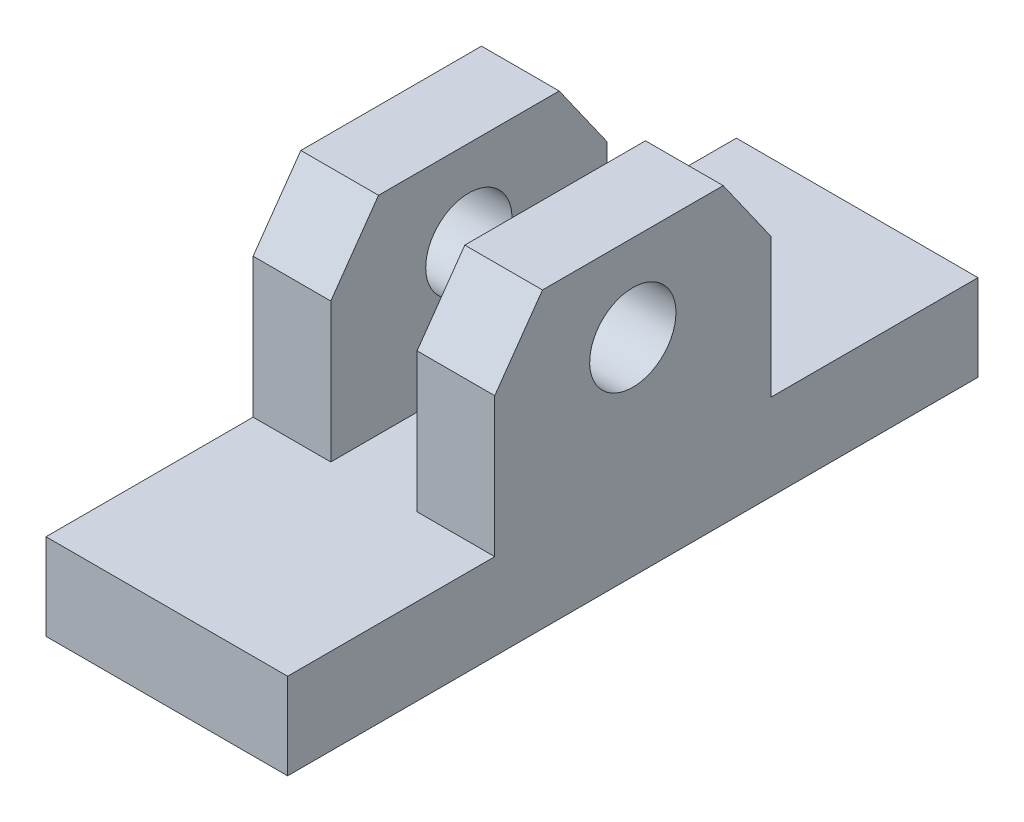
ISO-10303-21;
HEADER;
FILE_DESCRIPTION(('STEP AP214'),'2;1');
FILE_NAME('part.step','',(''),(''),'','','');
FILE_SCHEMA(('AUTOMOTIVE_DESIGN { 1 0 10303 214 1 1 1 1 }'));
ENDSEC;
DATA;
#1=APPLICATION_CONTEXT('core data for automotive mechanical design processes');
#2=APPLICATION_PROTOCOL_DEFINITION('international standard','automotive_design',2000,#1);
#3=PRODUCT_CONTEXT('',#1,'mechanical');
#4=PRODUCT('Part','Part','',(#3));
#5=PRODUCT_RELATED_PRODUCT_CATEGORY('part','',(#4));
#6=PRODUCT_DEFINITION_FORMATION('','',#4);
#7=PRODUCT_DEFINITION_CONTEXT('part definition',#1,'design');
#8=PRODUCT_DEFINITION('design','',#6,#7);
#9=PRODUCT_DEFINITION_SHAPE('','',#8);
#10=(LENGTH_UNIT() NAMED_UNIT(*) SI_UNIT(.MILLI.,.METRE.));
#11=(NAMED_UNIT(*) PLANE_ANGLE_UNIT() SI_UNIT($,.RADIAN.));
#12=(NAMED_UNIT(*) SI_UNIT($,.STERADIAN.) SOLID_ANGLE_UNIT());
#13=UNCERTAINTY_MEASURE_WITH_UNIT(LENGTH_MEASURE(1.E-05),#10,'distance_accuracy_value','');
#14=(GEOMETRIC_REPRESENTATION_CONTEXT(3) GLOBAL_UNCERTAINTY_ASSIGNED_CONTEXT((#13)) GLOBAL_UNIT_ASSIGNED_CONTEXT((#10,
#11,#12)) REPRESENTATION_CONTEXT('',''));
#15=CARTESIAN_POINT('',(0.,0.,0.));
#16=DIRECTION('',(0.,0.,1.));
#17=DIRECTION('',(1.,0.,0.));
#18=AXIS2_PLACEMENT_3D('',#15,#16,#17);
#19=CARTESIAN_POINT('',(14.,5.,-28.));
#20=DIRECTION('',(0.,0.,1.));
#21=DIRECTION('',(1.,0.,0.));
#22=AXIS2_PLACEMENT_3D('',#19,#20,#21);
#23=PLANE('',#22);
#24=DIRECTION('',(-1.,0.,0.));
#25=VECTOR('',#24,1.);
#26=CARTESIAN_POINT('',(14.,5.,-28.));
#27=LINE('',#26,#25);
#28=CARTESIAN_POINT('',(14.,5.,-28.));
#29=VERTEX_POINT('',#28);
#30=CARTESIAN_POINT('',(9.49934386128989,5.,-28.));
#31=VERTEX_POINT('',#30);
#32=EDGE_CURVE('E196',#29,#31,#27,.T.);
#33=ORIENTED_EDGE('',*,*,#32,.T.);
#34=DIRECTION('',(0.,1.,0.));
#35=VECTOR('',#34,1.);
#36=CARTESIAN_POINT('',(9.49934386128989,29.,-28.));
#37=LINE('',#36,#35);
#38=CARTESIAN_POINT('',(9.49934386128989,13.0775072839407,-28.));
#39=VERTEX_POINT('',#38);
#40=EDGE_CURVE('E290',#31,#39,#37,.T.);
#41=ORIENTED_EDGE('',*,*,#40,.T.);
#42=DIRECTION('',(-1.,0.,0.));
#43=VECTOR('',#42,1.);
#44=CARTESIAN_POINT('',(14.,13.0775072839407,-28.));
#45=LINE('',#44,#43);
#46=CARTESIAN_POINT('',(14.,13.0775072839407,-28.));
#47=VERTEX_POINT('',#46);
#48=EDGE_CURVE('E192',#47,#39,#45,.T.);
#49=ORIENTED_EDGE('',*,*,#48,.F.);
#50=DIRECTION('',(0.,1.,0.));
#51=VECTOR('',#50,1.);
#52=CARTESIAN_POINT('',(14.,5.,-28.));
#53=LINE('',#52,#51);
#54=EDGE_CURVE('E248',#29,#47,#53,.T.);
#55=ORIENTED_EDGE('',*,*,#54,.F.);
#56=EDGE_LOOP('',(#33,#41,#49,#55));
#57=FACE_BOUND('',#56,.T.);
#58=ADVANCED_FACE('F30',(#57),#23,.F.);
#59=CARTESIAN_POINT('',(14.,13.0775072839407,-28.));
#60=DIRECTION('',(0.,-0.576171491760876,0.817328827389593));
#61=DIRECTION('',(0.,-0.817328827389593,-0.576171491760876));
#62=AXIS2_PLACEMENT_3D('',#59,#60,#61);
#63=PLANE('',#62);
#64=ORIENTED_EDGE('',*,*,#48,.T.);
#65=DIRECTION('',(0.,0.817328827389593,0.576171491760876));
#66=VECTOR('',#65,1.);
#67=CARTESIAN_POINT('',(9.49934386128989,13.0775072839407,-28.));
#68=LINE('',#67,#66);
#69=CARTESIAN_POINT('',(9.49934386128989,17.,-25.2348601885838));
#70=VERTEX_POINT('',#69);
#71=EDGE_CURVE('E234',#39,#70,#68,.T.);
#72=ORIENTED_EDGE('',*,*,#71,.T.);
#73=DIRECTION('',(-1.,0.,0.));
#74=VECTOR('',#73,1.);
#75=CARTESIAN_POINT('',(14.,17.,-25.2348601885838));
#76=LINE('',#75,#74);
#77=CARTESIAN_POINT('',(14.,17.,-25.2348601885838));
#78=VERTEX_POINT('',#77);
#79=EDGE_CURVE('E188',#78,#70,#76,.T.);
#80=ORIENTED_EDGE('',*,*,#79,.F.);
#81=DIRECTION('',(0.,0.817328827389593,0.576171491760876));
#82=VECTOR('',#81,1.);
#83=CARTESIAN_POINT('',(14.,13.0775072839407,-28.));
#84=LINE('',#83,#82);
#85=EDGE_CURVE('E250',#47,#78,#84,.T.);
#86=ORIENTED_EDGE('',*,*,#85,.F.);
#87=EDGE_LOOP('',(#64,#72,#80,#86));
#88=FACE_BOUND('',#87,.T.);
#89=ADVANCED_FACE('F256',(#88),#63,.F.);
#90=CARTESIAN_POINT('',(14.,17.,-14.7651398114162));
#91=DIRECTION('',(0.,-1.,0.));
#92=DIRECTION('',(0.,0.,-1.));
#93=AXIS2_PLACEMENT_3D('',#90,#91,#92);
#94=PLANE('',#93);
#95=ORIENTED_EDGE('',*,*,#79,.T.);
#96=DIRECTION('',(0.,0.,1.));
#97=VECTOR('',#96,1.);
#98=CARTESIAN_POINT('',(9.49934386128989,17.,-14.7651398114162));
#99=LINE('',#98,#97);
#100=CARTESIAN_POINT('',(9.49934386128989,17.,-14.7651398114162));
#101=VERTEX_POINT('',#100);
#102=EDGE_CURVE('E231',#70,#101,#99,.T.);
#103=ORIENTED_EDGE('',*,*,#102,.T.);
#104=DIRECTION('',(-1.,0.,0.));
#105=VECTOR('',#104,1.);
#106=CARTESIAN_POINT('',(14.,17.,-14.7651398114162));
#107=LINE('',#106,#105);
#108=CARTESIAN_POINT('',(14.,17.,-14.7651398114162));
#109=VERTEX_POINT('',#108);
#110=EDGE_CURVE('E185',#109,#101,#107,.T.);
#111=ORIENTED_EDGE('',*,*,#110,.F.);
#112=DIRECTION('',(0.,0.,1.));
#113=VECTOR('',#112,1.);
#114=CARTESIAN_POINT('',(14.,17.,-14.7651398114162));
#115=LINE('',#114,#113);
#116=EDGE_CURVE('E129',#78,#109,#115,.T.);
#117=ORIENTED_EDGE('',*,*,#116,.F.);
#118=EDGE_LOOP('',(#95,#103,#111,#117));
#119=FACE_BOUND('',#118,.T.);
#120=ADVANCED_FACE('F259',(#119),#94,.F.);
#121=CARTESIAN_POINT('',(14.,13.0775072839407,-12.));
#122=DIRECTION('',(0.,-0.576171491760876,-0.817328827389593));
#123=DIRECTION('',(0.,0.817328827389593,-0.576171491760876));
#124=AXIS2_PLACEMENT_3D('',#121,#122,#123);
#125=PLANE('',#124);
#126=ORIENTED_EDGE('',*,*,#110,.T.);
#127=DIRECTION('',(0.,-0.817328827389593,0.576171491760876));
#128=VECTOR('',#127,1.);
#129=CARTESIAN_POINT('',(9.49934386128989,13.0775072839407,-12.));
#130=LINE('',#129,#128);
#131=CARTESIAN_POINT('',(9.49934386128989,13.0775072839407,-12.));
#132=VERTEX_POINT('',#131);
#133=EDGE_CURVE('E140',#101,#132,#130,.T.);
#134=ORIENTED_EDGE('',*,*,#133,.T.);
#135=DIRECTION('',(-1.,0.,0.));
#136=VECTOR('',#135,1.);
#137=CARTESIAN_POINT('',(14.,13.0775072839407,-12.));
#138=LINE('',#137,#136);
#139=CARTESIAN_POINT('',(14.,13.0775072839407,-12.));
#140=VERTEX_POINT('',#139);
#141=EDGE_CURVE('E136',#140,#132,#138,.T.);
#142=ORIENTED_EDGE('',*,*,#141,.F.);
#143=DIRECTION('',(0.,-0.817328827389593,0.576171491760876));
#144=VECTOR('',#143,1.);
#145=CARTESIAN_POINT('',(14.,13.0775072839407,-12.));
#146=LINE('',#145,#144);
#147=EDGE_CURVE('E121',#109,#140,#146,.T.);
#148=ORIENTED_EDGE('',*,*,#147,.F.);
#149=EDGE_LOOP('',(#126,#134,#142,#148));
#150=FACE_BOUND('',#149,.T.);
#151=ADVANCED_FACE('F137',(#150),#125,.F.);
#152=CARTESIAN_POINT('',(14.,5.,-12.));
#153=DIRECTION('',(0.,0.,-1.));
#154=DIRECTION('',(-1.,0.,0.));
#155=AXIS2_PLACEMENT_3D('',#152,#153,#154);
#156=PLANE('',#155);
#157=ORIENTED_EDGE('',*,*,#141,.T.);
#158=DIRECTION('',(0.,1.,0.));
#159=VECTOR('',#158,1.);
#160=CARTESIAN_POINT('',(9.49934386128989,29.,-12.));
#161=LINE('',#160,#159);
#162=CARTESIAN_POINT('',(9.49934386128989,5.,-12.));
#163=VERTEX_POINT('',#162);
#164=EDGE_CURVE('E317',#163,#132,#161,.T.);
#165=ORIENTED_EDGE('',*,*,#164,.F.);
#166=DIRECTION('',(-1.,0.,0.));
#167=VECTOR('',#166,1.);
#168=CARTESIAN_POINT('',(14.,5.,-12.));
#169=LINE('',#168,#167);
#170=CARTESIAN_POINT('',(14.,5.,-12.));
#171=VERTEX_POINT('',#170);
#172=EDGE_CURVE('E148',#171,#163,#169,.T.);
#173=ORIENTED_EDGE('',*,*,#172,.F.);
#174=DIRECTION('',(0.,-1.,0.));
#175=VECTOR('',#174,1.);
#176=CARTESIAN_POINT('',(14.,5.,-12.));
#177=LINE('',#176,#175);
#178=EDGE_CURVE('E126',#140,#171,#177,.T.);
#179=ORIENTED_EDGE('',*,*,#178,.F.);
#180=EDGE_LOOP('',(#157,#165,#173,#179));
#181=FACE_BOUND('',#180,.T.);
#182=ADVANCED_FACE('F146',(#181),#156,.F.);
#183=CARTESIAN_POINT('',(14.,12.,-20.));
#184=DIRECTION('',(-1.,0.,0.));
#185=DIRECTION('',(0.,0.,1.));
#186=AXIS2_PLACEMENT_3D('',#183,#184,#185);
#187=CYLINDRICAL_SURFACE('',#186,2.5);
#188=CARTESIAN_POINT('',(9.49934386128989,12.,-20.));
#189=DIRECTION('',(1.,0.,0.));
#190=DIRECTION('',(0.,1.,0.));
#191=AXIS2_PLACEMENT_3D('',#188,#189,#190);
#192=CIRCLE('',#191,2.5);
#193=CARTESIAN_POINT('',(9.49934386128989,14.5,-20.));
#194=VERTEX_POINT('',#193);
#195=EDGE_CURVE('E34',#194,#194,#192,.T.);
#196=ORIENTED_EDGE('',*,*,#195,.F.);
#197=EDGE_LOOP('',(#196));
#198=FACE_BOUND('',#197,.T.);
#199=CARTESIAN_POINT('',(14.,12.,-20.));
#200=DIRECTION('',(1.,0.,0.));
#201=DIRECTION('',(0.,0.,-1.));
#202=AXIS2_PLACEMENT_3D('',#199,#200,#201);
#203=CIRCLE('',#202,2.5);
#204=CARTESIAN_POINT('',(14.,12.,-22.5));
#205=VERTEX_POINT('',#204);
#206=EDGE_CURVE('E158',#205,#205,#203,.T.);
#207=ORIENTED_EDGE('',*,*,#206,.T.);
#208=EDGE_LOOP('',(#207));
#209=FACE_BOUND('',#208,.T.);
#210=ADVANCED_FACE('F355',(#198,#209),#187,.F.);
#211=CARTESIAN_POINT('',(14.,5.,0.));
#212=DIRECTION('',(-1.,0.,0.));
#213=DIRECTION('',(0.,0.,1.));
#214=AXIS2_PLACEMENT_3D('',#211,#212,#213);
#215=PLANE('',#214);
#216=DIRECTION('',(0.,-1.,0.));
#217=VECTOR('',#216,1.);
#218=CARTESIAN_POINT('',(14.,0.,0.));
#219=LINE('',#218,#217);
#220=CARTESIAN_POINT('',(14.,5.,0.));
#221=VERTEX_POINT('',#220);
#222=CARTESIAN_POINT('',(14.,0.,0.));
#223=VERTEX_POINT('',#222);
#224=EDGE_CURVE('E181',#221,#223,#219,.T.);
#225=ORIENTED_EDGE('',*,*,#224,.T.);
#226=DIRECTION('',(0.,0.,-1.));
#227=VECTOR('',#226,1.);
#228=CARTESIAN_POINT('',(14.,0.,0.));
#229=LINE('',#228,#227);
#230=CARTESIAN_POINT('',(14.,0.,-40.));
#231=VERTEX_POINT('',#230);
#232=EDGE_CURVE('E100',#223,#231,#229,.T.);
#233=ORIENTED_EDGE('',*,*,#232,.T.);
#234=DIRECTION('',(0.,1.,0.));
#235=VECTOR('',#234,1.);
#236=CARTESIAN_POINT('',(14.,0.,-40.));
#237=LINE('',#236,#235);
#238=CARTESIAN_POINT('',(14.,5.,-40.));
#239=VERTEX_POINT('',#238);
#240=EDGE_CURVE('E244',#231,#239,#237,.T.);
#241=ORIENTED_EDGE('',*,*,#240,.T.);
#242=DIRECTION('',(0.,0.,1.));
#243=VECTOR('',#242,1.);
#244=CARTESIAN_POINT('',(14.,5.,-40.));
#245=LINE('',#244,#243);
#246=EDGE_CURVE('E246',#239,#29,#245,.T.);
#247=ORIENTED_EDGE('',*,*,#246,.T.);
#248=ORIENTED_EDGE('',*,*,#54,.T.);
#249=ORIENTED_EDGE('',*,*,#85,.T.);
#250=ORIENTED_EDGE('',*,*,#116,.T.);
#251=ORIENTED_EDGE('',*,*,#147,.T.);
#252=ORIENTED_EDGE('',*,*,#178,.T.);
#253=DIRECTION('',(0.,0.,1.));
#254=VECTOR('',#253,1.);
#255=CARTESIAN_POINT('',(14.,5.,0.));
#256=LINE('',#255,#254);
#257=EDGE_CURVE('E56',#171,#221,#256,.T.);
#258=ORIENTED_EDGE('',*,*,#257,.T.);
#259=EDGE_LOOP('',(#225,#233,#241,#247,#248,#249,#250,#251,#252,#258));
#260=FACE_BOUND('',#259,.T.);
#261=ORIENTED_EDGE('',*,*,#206,.F.);
#262=EDGE_LOOP('',(#261));
#263=FACE_BOUND('',#262,.T.);
#264=ADVANCED_FACE('F123',(#260,#263),#215,.F.);
#265=CARTESIAN_POINT('',(0.,5.,0.));
#266=DIRECTION('',(-1.,0.,0.));
#267=DIRECTION('',(0.,0.,1.));
#268=AXIS2_PLACEMENT_3D('',#265,#266,#267);
#269=PLANE('',#268);
#270=DIRECTION('',(0.,-1.,0.));
#271=VECTOR('',#270,1.);
#272=CARTESIAN_POINT('',(0.,0.,0.));
#273=LINE('',#272,#271);
#274=CARTESIAN_POINT('',(0.,5.,0.));
#275=VERTEX_POINT('',#274);
#276=CARTESIAN_POINT('',(0.,0.,0.));
#277=VERTEX_POINT('',#276);
#278=EDGE_CURVE('E154',#275,#277,#273,.T.);
#279=ORIENTED_EDGE('',*,*,#278,.F.);
#280=DIRECTION('',(0.,0.,1.));
#281=VECTOR('',#280,1.);
#282=CARTESIAN_POINT('',(0.,5.,0.));
#283=LINE('',#282,#281);
#284=CARTESIAN_POINT('',(0.,5.,-12.));
#285=VERTEX_POINT('',#284);
#286=EDGE_CURVE('E92',#285,#275,#283,.T.);
#287=ORIENTED_EDGE('',*,*,#286,.F.);
#288=DIRECTION('',(0.,-1.,0.));
#289=VECTOR('',#288,1.);
#290=CARTESIAN_POINT('',(0.,5.,-12.));
#291=LINE('',#290,#289);
#292=CARTESIAN_POINT('',(0.,13.0775072839407,-12.));
#293=VERTEX_POINT('',#292);
#294=EDGE_CURVE('E177',#293,#285,#291,.T.);
#295=ORIENTED_EDGE('',*,*,#294,.F.);
#296=DIRECTION('',(0.,-0.817328827389593,0.576171491760876));
#297=VECTOR('',#296,1.);
#298=CARTESIAN_POINT('',(0.,13.0775072839407,-12.));
#299=LINE('',#298,#297);
#300=CARTESIAN_POINT('',(0.,17.,-14.7651398114162));
#301=VERTEX_POINT('',#300);
#302=EDGE_CURVE('E174',#301,#293,#299,.T.);
#303=ORIENTED_EDGE('',*,*,#302,.F.);
#304=DIRECTION('',(0.,0.,1.));
#305=VECTOR('',#304,1.);
#306=CARTESIAN_POINT('',(0.,17.,-14.7651398114162));
#307=LINE('',#306,#305);
#308=CARTESIAN_POINT('',(0.,17.,-25.2348601885838));
#309=VERTEX_POINT('',#308);
#310=EDGE_CURVE('E171',#309,#301,#307,.T.);
#311=ORIENTED_EDGE('',*,*,#310,.F.);
#312=DIRECTION('',(0.,0.817328827389593,0.576171491760876));
#313=VECTOR('',#312,1.);
#314=CARTESIAN_POINT('',(0.,13.0775072839407,-28.));
#315=LINE('',#314,#313);
#316=CARTESIAN_POINT('',(0.,13.0775072839407,-28.));
#317=VERTEX_POINT('',#316);
#318=EDGE_CURVE('E168',#317,#309,#315,.T.);
#319=ORIENTED_EDGE('',*,*,#318,.F.);
#320=DIRECTION('',(0.,1.,0.));
#321=VECTOR('',#320,1.);
#322=CARTESIAN_POINT('',(0.,5.,-28.));
#323=LINE('',#322,#321);
#324=CARTESIAN_POINT('',(0.,5.,-28.));
#325=VERTEX_POINT('',#324);
#326=EDGE_CURVE('E165',#325,#317,#323,.T.);
#327=ORIENTED_EDGE('',*,*,#326,.F.);
#328=DIRECTION('',(0.,0.,1.));
#329=VECTOR('',#328,1.);
#330=CARTESIAN_POINT('',(0.,5.,-40.));
#331=LINE('',#330,#329);
#332=CARTESIAN_POINT('',(0.,5.,-40.));
#333=VERTEX_POINT('',#332);
#334=EDGE_CURVE('E162',#333,#325,#331,.T.);
#335=ORIENTED_EDGE('',*,*,#334,.F.);
#336=DIRECTION('',(0.,1.,0.));
#337=VECTOR('',#336,1.);
#338=CARTESIAN_POINT('',(0.,0.,-40.));
#339=LINE('',#338,#337);
#340=CARTESIAN_POINT('',(0.,0.,-40.));
#341=VERTEX_POINT('',#340);
#342=EDGE_CURVE('E160',#341,#333,#339,.T.);
#343=ORIENTED_EDGE('',*,*,#342,.F.);
#344=DIRECTION('',(0.,0.,-1.));
#345=VECTOR('',#344,1.);
#346=CARTESIAN_POINT('',(0.,0.,0.));
#347=LINE('',#346,#345);
#348=EDGE_CURVE('E157',#277,#341,#347,.T.);
#349=ORIENTED_EDGE('',*,*,#348,.F.);
#350=EDGE_LOOP('',(#279,#287,#295,#303,#311,#319,#327,#335,#343,#349));
#351=FACE_BOUND('',#350,.T.);
#352=CARTESIAN_POINT('',(0.,12.,-20.));
#353=DIRECTION('',(1.,0.,0.));
#354=DIRECTION('',(0.,0.,-1.));
#355=AXIS2_PLACEMENT_3D('',#352,#353,#354);
#356=CIRCLE('',#355,2.5);
#357=CARTESIAN_POINT('',(0.,12.,-22.5));
#358=VERTEX_POINT('',#357);
#359=EDGE_CURVE('E237',#358,#358,#356,.T.);
#360=ORIENTED_EDGE('',*,*,#359,.T.);
#361=EDGE_LOOP('',(#360));
#362=FACE_BOUND('',#361,.T.);
#363=ADVANCED_FACE('F301',(#351,#362),#269,.T.);
#364=CARTESIAN_POINT('',(14.,0.,0.));
#365=DIRECTION('',(0.,0.,-1.));
#366=DIRECTION('',(-1.,0.,0.));
#367=AXIS2_PLACEMENT_3D('',#364,#365,#366);
#368=PLANE('',#367);
#369=ORIENTED_EDGE('',*,*,#278,.T.);
#370=DIRECTION('',(-1.,0.,0.));
#371=VECTOR('',#370,1.);
#372=CARTESIAN_POINT('',(14.,0.,0.));
#373=LINE('',#372,#371);
#374=EDGE_CURVE('E11',#223,#277,#373,.T.);
#375=ORIENTED_EDGE('',*,*,#374,.F.);
#376=ORIENTED_EDGE('',*,*,#224,.F.);
#377=DIRECTION('',(-1.,0.,0.));
#378=VECTOR('',#377,1.);
#379=CARTESIAN_POINT('',(14.,5.,0.));
#380=LINE('',#379,#378);
#381=EDGE_CURVE('E150',#221,#275,#380,.T.);
#382=ORIENTED_EDGE('',*,*,#381,.T.);
#383=EDGE_LOOP('',(#369,#375,#376,#382));
#384=FACE_BOUND('',#383,.T.);
#385=ADVANCED_FACE('F32',(#384),#368,.F.);
#386=CARTESIAN_POINT('',(14.,0.,0.));
#387=DIRECTION('',(0.,1.,0.));
#388=DIRECTION('',(0.,0.,1.));
#389=AXIS2_PLACEMENT_3D('',#386,#387,#388);
#390=PLANE('',#389);
#391=ORIENTED_EDGE('',*,*,#348,.T.);
#392=DIRECTION('',(-1.,0.,0.));
#393=VECTOR('',#392,1.);
#394=CARTESIAN_POINT('',(14.,0.,-40.));
#395=LINE('',#394,#393);
#396=EDGE_CURVE('E39',#231,#341,#395,.T.);
#397=ORIENTED_EDGE('',*,*,#396,.F.);
#398=ORIENTED_EDGE('',*,*,#232,.F.);
#399=ORIENTED_EDGE('',*,*,#374,.T.);
#400=EDGE_LOOP('',(#391,#397,#398,#399));
#401=FACE_BOUND('',#400,.T.);
#402=ADVANCED_FACE('F326',(#401),#390,.F.);
#403=CARTESIAN_POINT('',(14.,0.,-40.));
#404=DIRECTION('',(0.,0.,1.));
#405=DIRECTION('',(1.,0.,0.));
#406=AXIS2_PLACEMENT_3D('',#403,#404,#405);
#407=PLANE('',#406);
#408=ORIENTED_EDGE('',*,*,#342,.T.);
#409=DIRECTION('',(-1.,0.,0.));
#410=VECTOR('',#409,1.);
#411=CARTESIAN_POINT('',(14.,5.,-40.));
#412=LINE('',#411,#410);
#413=EDGE_CURVE('E199',#239,#333,#412,.T.);
#414=ORIENTED_EDGE('',*,*,#413,.F.);
#415=ORIENTED_EDGE('',*,*,#240,.F.);
#416=ORIENTED_EDGE('',*,*,#396,.T.);
#417=EDGE_LOOP('',(#408,#414,#415,#416));
#418=FACE_BOUND('',#417,.T.);
#419=ADVANCED_FACE('F328',(#418),#407,.F.);
#420=CARTESIAN_POINT('',(4.50065613871011,13.0775072839407,-28.));
#421=VERTEX_POINT('',#420);
#422=EDGE_CURVE('E191',#421,#317,#45,.T.);
#423=ORIENTED_EDGE('',*,*,#422,.F.);
#424=DIRECTION('',(0.,-1.,0.));
#425=VECTOR('',#424,1.);
#426=CARTESIAN_POINT('',(4.50065613871011,29.,-28.));
#427=LINE('',#426,#425);
#428=CARTESIAN_POINT('',(4.50065613871011,5.,-28.));
#429=VERTEX_POINT('',#428);
#430=EDGE_CURVE('E219',#421,#429,#427,.T.);
#431=ORIENTED_EDGE('',*,*,#430,.T.);
#432=EDGE_CURVE('E195',#429,#325,#27,.T.);
#433=ORIENTED_EDGE('',*,*,#432,.T.);
#434=ORIENTED_EDGE('',*,*,#326,.T.);
#435=EDGE_LOOP('',(#423,#431,#433,#434));
#436=FACE_BOUND('',#435,.T.);
#437=ADVANCED_FACE('F289',(#436),#23,.F.);
#438=CARTESIAN_POINT('',(4.50065613871011,17.,-25.2348601885838));
#439=VERTEX_POINT('',#438);
#440=EDGE_CURVE('E187',#439,#309,#76,.T.);
#441=ORIENTED_EDGE('',*,*,#440,.F.);
#442=DIRECTION('',(0.,-0.817328827389593,-0.576171491760876));
#443=VECTOR('',#442,1.);
#444=CARTESIAN_POINT('',(4.50065613871011,13.0775072839407,-28.));
#445=LINE('',#444,#443);
#446=EDGE_CURVE('E227',#439,#421,#445,.T.);
#447=ORIENTED_EDGE('',*,*,#446,.T.);
#448=ORIENTED_EDGE('',*,*,#422,.T.);
#449=ORIENTED_EDGE('',*,*,#318,.T.);
#450=EDGE_LOOP('',(#441,#447,#448,#449));
#451=FACE_BOUND('',#450,.T.);
#452=ADVANCED_FACE('F307',(#451),#63,.F.);
#453=CARTESIAN_POINT('',(4.50065613871011,17.,-14.7651398114162));
#454=VERTEX_POINT('',#453);
#455=EDGE_CURVE('E143',#454,#301,#107,.T.);
#456=ORIENTED_EDGE('',*,*,#455,.F.);
#457=DIRECTION('',(0.,0.,-1.));
#458=VECTOR('',#457,1.);
#459=CARTESIAN_POINT('',(4.50065613871011,17.,-14.7651398114162));
#460=LINE('',#459,#458);
#461=EDGE_CURVE('E210',#454,#439,#460,.T.);
#462=ORIENTED_EDGE('',*,*,#461,.T.);
#463=ORIENTED_EDGE('',*,*,#440,.T.);
#464=ORIENTED_EDGE('',*,*,#310,.T.);
#465=EDGE_LOOP('',(#456,#462,#463,#464));
#466=FACE_BOUND('',#465,.T.);
#467=ADVANCED_FACE('F310',(#466),#94,.F.);
#468=CARTESIAN_POINT('',(4.50065613871011,13.0775072839407,-12.));
#469=VERTEX_POINT('',#468);
#470=EDGE_CURVE('E144',#469,#293,#138,.T.);
#471=ORIENTED_EDGE('',*,*,#470,.F.);
#472=DIRECTION('',(0.,0.817328827389593,-0.576171491760876));
#473=VECTOR('',#472,1.);
#474=CARTESIAN_POINT('',(4.50065613871011,13.0775072839407,-12.));
#475=LINE('',#474,#473);
#476=EDGE_CURVE('E205',#469,#454,#475,.T.);
#477=ORIENTED_EDGE('',*,*,#476,.T.);
#478=ORIENTED_EDGE('',*,*,#455,.T.);
#479=ORIENTED_EDGE('',*,*,#302,.T.);
#480=EDGE_LOOP('',(#471,#477,#478,#479));
#481=FACE_BOUND('',#480,.T.);
#482=ADVANCED_FACE('F313',(#481),#125,.F.);
#483=CARTESIAN_POINT('',(4.50065613871011,5.,-12.));
#484=VERTEX_POINT('',#483);
#485=EDGE_CURVE('E183',#484,#285,#169,.T.);
#486=ORIENTED_EDGE('',*,*,#485,.F.);
#487=DIRECTION('',(0.,-1.,0.));
#488=VECTOR('',#487,1.);
#489=CARTESIAN_POINT('',(4.50065613871011,29.,-12.));
#490=LINE('',#489,#488);
#491=EDGE_CURVE('E222',#469,#484,#490,.T.);
#492=ORIENTED_EDGE('',*,*,#491,.F.);
#493=ORIENTED_EDGE('',*,*,#470,.T.);
#494=ORIENTED_EDGE('',*,*,#294,.T.);
#495=EDGE_LOOP('',(#486,#492,#493,#494));
#496=FACE_BOUND('',#495,.T.);
#497=ADVANCED_FACE('F316',(#496),#156,.F.);
#498=CARTESIAN_POINT('',(14.,5.,0.));
#499=DIRECTION('',(0.,-1.,0.));
#500=DIRECTION('',(0.,0.,-1.));
#501=AXIS2_PLACEMENT_3D('',#498,#499,#500);
#502=PLANE('',#501);
#503=ORIENTED_EDGE('',*,*,#286,.T.);
#504=ORIENTED_EDGE('',*,*,#381,.F.);
#505=ORIENTED_EDGE('',*,*,#257,.F.);
#506=ORIENTED_EDGE('',*,*,#172,.T.);
#507=DIRECTION('',(0.,0.,1.));
#508=VECTOR('',#507,1.);
#509=CARTESIAN_POINT('',(9.49934386128989,5.,-28.));
#510=LINE('',#509,#508);
#511=EDGE_CURVE('E206',#31,#163,#510,.T.);
#512=ORIENTED_EDGE('',*,*,#511,.F.);
#513=ORIENTED_EDGE('',*,*,#32,.F.);
#514=ORIENTED_EDGE('',*,*,#246,.F.);
#515=ORIENTED_EDGE('',*,*,#413,.T.);
#516=ORIENTED_EDGE('',*,*,#334,.T.);
#517=ORIENTED_EDGE('',*,*,#432,.F.);
#518=DIRECTION('',(0.,0.,1.));
#519=VECTOR('',#518,1.);
#520=CARTESIAN_POINT('',(4.50065613871011,5.,-28.));
#521=LINE('',#520,#519);
#522=EDGE_CURVE('E47',#429,#484,#521,.T.);
#523=ORIENTED_EDGE('',*,*,#522,.T.);
#524=ORIENTED_EDGE('',*,*,#485,.T.);
#525=EDGE_LOOP('',(#503,#504,#505,#506,#512,#513,#514,#515,#516,#517,#523,#524));
#526=FACE_BOUND('',#525,.T.);
#527=ADVANCED_FACE('F292',(#526),#502,.F.);
#528=CARTESIAN_POINT('',(4.50065613871011,12.,-20.));
#529=DIRECTION('',(-1.,0.,0.));
#530=DIRECTION('',(0.,0.,1.));
#531=AXIS2_PLACEMENT_3D('',#528,#529,#530);
#532=CIRCLE('',#531,2.5);
#533=CARTESIAN_POINT('',(4.50065613871011,12.,-17.5));
#534=VERTEX_POINT('',#533);
#535=EDGE_CURVE('E203',#534,#534,#532,.T.);
#536=ORIENTED_EDGE('',*,*,#535,.F.);
#537=EDGE_LOOP('',(#536));
#538=FACE_BOUND('',#537,.T.);
#539=ORIENTED_EDGE('',*,*,#359,.F.);
#540=EDGE_LOOP('',(#539));
#541=FACE_BOUND('',#540,.T.);
#542=ADVANCED_FACE('F361',(#538,#541),#187,.F.);
#543=CARTESIAN_POINT('',(9.49934386128989,29.,-28.));
#544=DIRECTION('',(1.,0.,0.));
#545=DIRECTION('',(0.,1.,0.));
#546=AXIS2_PLACEMENT_3D('',#543,#544,#545);
#547=PLANE('',#546);
#548=ORIENTED_EDGE('',*,*,#195,.T.);
#549=EDGE_LOOP('',(#548));
#550=FACE_BOUND('',#549,.T.);
#551=ORIENTED_EDGE('',*,*,#40,.F.);
#552=ORIENTED_EDGE('',*,*,#511,.T.);
#553=ORIENTED_EDGE('',*,*,#164,.T.);
#554=ORIENTED_EDGE('',*,*,#133,.F.);
#555=ORIENTED_EDGE('',*,*,#102,.F.);
#556=ORIENTED_EDGE('',*,*,#71,.F.);
#557=EDGE_LOOP('',(#551,#552,#553,#554,#555,#556));
#558=FACE_BOUND('',#557,.T.);
#559=ADVANCED_FACE('F320',(#550,#558),#547,.F.);
#560=CARTESIAN_POINT('',(4.50065613871011,29.,-28.));
#561=DIRECTION('',(-1.,0.,0.));
#562=DIRECTION('',(0.,0.,1.));
#563=AXIS2_PLACEMENT_3D('',#560,#561,#562);
#564=PLANE('',#563);
#565=ORIENTED_EDGE('',*,*,#535,.T.);
#566=EDGE_LOOP('',(#565));
#567=FACE_BOUND('',#566,.T.);
#568=ORIENTED_EDGE('',*,*,#461,.F.);
#569=ORIENTED_EDGE('',*,*,#476,.F.);
#570=ORIENTED_EDGE('',*,*,#491,.T.);
#571=ORIENTED_EDGE('',*,*,#522,.F.);
#572=ORIENTED_EDGE('',*,*,#430,.F.);
#573=ORIENTED_EDGE('',*,*,#446,.F.);
#574=EDGE_LOOP('',(#568,#569,#570,#571,#572,#573));
#575=FACE_BOUND('',#574,.T.);
#576=ADVANCED_FACE('F284',(#567,#575),#564,.F.);
#577=CLOSED_SHELL('',(#58,#89,#120,#151,#182,#210,#264,#363,#385,#402,#419,#437,#452,#467,#482,
#497,#527,#542,#559,#576));
#578=MANIFOLD_SOLID_BREP('B2',#577);
#579=ADVANCED_BREP_SHAPE_REPRESENTATION('',(#18,#578),#14);
#580=SHAPE_DEFINITION_REPRESENTATION(#9,#579);
ENDSEC;
END-ISO-10303-21;
